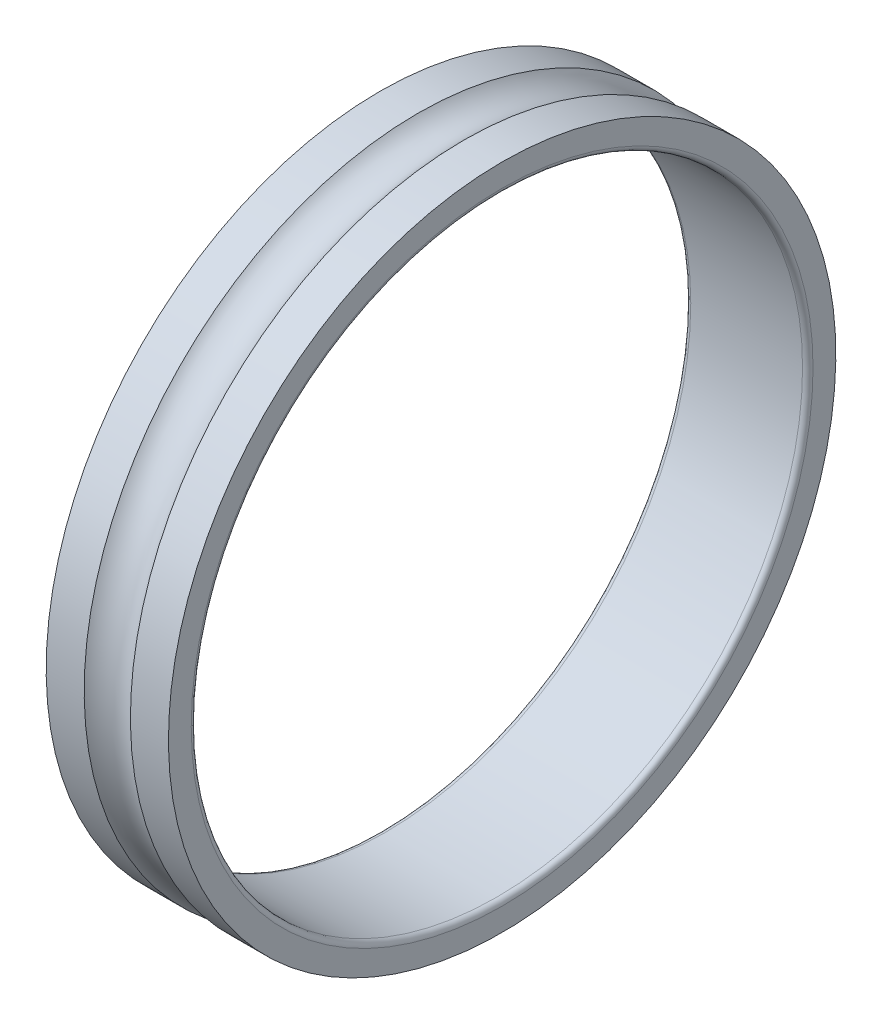
ISO-10303-21;
HEADER;
FILE_DESCRIPTION(('STEP AP214'),'2;1');
FILE_NAME('part.step','',(''),(''),'','','');
FILE_SCHEMA(('AUTOMOTIVE_DESIGN { 1 0 10303 214 1 1 1 1 }'));
ENDSEC;
DATA;
#1=APPLICATION_CONTEXT('core data for automotive mechanical design processes');
#2=APPLICATION_PROTOCOL_DEFINITION('international standard','automotive_design',2000,#1);
#3=PRODUCT_CONTEXT('',#1,'mechanical');
#4=PRODUCT('Part','Part','',(#3));
#5=PRODUCT_RELATED_PRODUCT_CATEGORY('part','',(#4));
#6=PRODUCT_DEFINITION_FORMATION('','',#4);
#7=PRODUCT_DEFINITION_CONTEXT('part definition',#1,'design');
#8=PRODUCT_DEFINITION('design','',#6,#7);
#9=PRODUCT_DEFINITION_SHAPE('','',#8);
#10=(LENGTH_UNIT() NAMED_UNIT(*) SI_UNIT(.MILLI.,.METRE.));
#11=(NAMED_UNIT(*) PLANE_ANGLE_UNIT() SI_UNIT($,.RADIAN.));
#12=(NAMED_UNIT(*) SI_UNIT($,.STERADIAN.) SOLID_ANGLE_UNIT());
#13=UNCERTAINTY_MEASURE_WITH_UNIT(LENGTH_MEASURE(1.E-05),#10,'distance_accuracy_value','');
#14=(GEOMETRIC_REPRESENTATION_CONTEXT(3) GLOBAL_UNCERTAINTY_ASSIGNED_CONTEXT((#13)) GLOBAL_UNIT_ASSIGNED_CONTEXT((#10,
#11,#12)) REPRESENTATION_CONTEXT('',''));
#15=CARTESIAN_POINT('',(0.,0.,0.));
#16=DIRECTION('',(0.,0.,1.));
#17=DIRECTION('',(1.,0.,0.));
#18=AXIS2_PLACEMENT_3D('',#15,#16,#17);
#19=CARTESIAN_POINT('',(5.91171651785338,0.,0.));
#20=DIRECTION('',(-1.,0.,0.));
#21=DIRECTION('',(0.,1.,0.));
#22=AXIS2_PLACEMENT_3D('',#19,#20,#21);
#23=CYLINDRICAL_SURFACE('',#22,19.105);
#24=CARTESIAN_POINT('',(4.82343303570677,0.,0.));
#25=DIRECTION('',(1.,0.,0.));
#26=DIRECTION('',(0.,1.,0.));
#27=AXIS2_PLACEMENT_3D('',#24,#25,#26);
#28=CIRCLE('',#27,19.105);
#29=CARTESIAN_POINT('',(4.82343303570677,19.105,0.));
#30=VERTEX_POINT('',#29);
#31=EDGE_CURVE('E11',#30,#30,#28,.T.);
#32=ORIENTED_EDGE('',*,*,#31,.T.);
#33=EDGE_LOOP('',(#32));
#34=FACE_BOUND('',#33,.T.);
#35=CARTESIAN_POINT('',(7.,0.,0.));
#36=DIRECTION('',(1.,0.,0.));
#37=DIRECTION('',(0.,1.,0.));
#38=AXIS2_PLACEMENT_3D('',#35,#36,#37);
#39=CIRCLE('',#38,19.105);
#40=CARTESIAN_POINT('',(7.,19.105,0.));
#41=VERTEX_POINT('',#40);
#42=EDGE_CURVE('E20',#41,#41,#39,.T.);
#43=ORIENTED_EDGE('',*,*,#42,.F.);
#44=EDGE_LOOP('',(#43));
#45=FACE_BOUND('',#44,.T.);
#46=ADVANCED_FACE('F16',(#34,#45),#23,.T.);
#47=CARTESIAN_POINT('',(3.5,0.,0.));
#48=DIRECTION('',(1.,0.,0.));
#49=DIRECTION('',(0.,0.,-1.));
#50=AXIS2_PLACEMENT_3D('',#47,#48,#49);
#51=TOROIDAL_SURFACE('',#50,20.25,1.75);
#52=CARTESIAN_POINT('',(2.17656696429324,0.,0.));
#53=DIRECTION('',(1.,0.,0.));
#54=DIRECTION('',(0.,1.,0.));
#55=AXIS2_PLACEMENT_3D('',#52,#53,#54);
#56=CIRCLE('',#55,19.105);
#57=CARTESIAN_POINT('',(2.17656696429324,19.105,0.));
#58=VERTEX_POINT('',#57);
#59=EDGE_CURVE('E26',#58,#58,#56,.T.);
#60=ORIENTED_EDGE('',*,*,#59,.T.);
#61=EDGE_LOOP('',(#60));
#62=FACE_BOUND('',#61,.T.);
#63=ORIENTED_EDGE('',*,*,#31,.F.);
#64=EDGE_LOOP('',(#63));
#65=FACE_BOUND('',#64,.T.);
#66=ADVANCED_FACE('F72',(#62,#65),#51,.F.);
#67=CARTESIAN_POINT('',(1.08828348214662,0.,0.));
#68=DIRECTION('',(-1.,0.,0.));
#69=DIRECTION('',(0.,1.,0.));
#70=AXIS2_PLACEMENT_3D('',#67,#68,#69);
#71=CYLINDRICAL_SURFACE('',#70,19.105);
#72=CARTESIAN_POINT('',(0.,0.,0.));
#73=DIRECTION('',(1.,0.,0.));
#74=DIRECTION('',(0.,1.,0.));
#75=AXIS2_PLACEMENT_3D('',#72,#73,#74);
#76=CIRCLE('',#75,19.105);
#77=CARTESIAN_POINT('',(0.,19.105,0.));
#78=VERTEX_POINT('',#77);
#79=EDGE_CURVE('E49',#78,#78,#76,.T.);
#80=ORIENTED_EDGE('',*,*,#79,.T.);
#81=EDGE_LOOP('',(#80));
#82=FACE_BOUND('',#81,.T.);
#83=ORIENTED_EDGE('',*,*,#59,.F.);
#84=EDGE_LOOP('',(#83));
#85=FACE_BOUND('',#84,.T.);
#86=ADVANCED_FACE('F50',(#82,#85),#71,.T.);
#87=CARTESIAN_POINT('',(0.,18.4525,0.));
#88=DIRECTION('',(-1.,0.,0.));
#89=DIRECTION('',(0.,-1.,0.));
#90=AXIS2_PLACEMENT_3D('',#87,#88,#89);
#91=PLANE('',#90);
#92=CARTESIAN_POINT('',(0.,0.,0.));
#93=DIRECTION('',(1.,0.,0.));
#94=DIRECTION('',(0.,1.,0.));
#95=AXIS2_PLACEMENT_3D('',#92,#93,#94);
#96=CIRCLE('',#95,17.8);
#97=CARTESIAN_POINT('',(0.,17.8,0.));
#98=VERTEX_POINT('',#97);
#99=EDGE_CURVE('E53',#98,#98,#96,.T.);
#100=ORIENTED_EDGE('',*,*,#99,.T.);
#101=EDGE_LOOP('',(#100));
#102=FACE_BOUND('',#101,.T.);
#103=ORIENTED_EDGE('',*,*,#79,.F.);
#104=EDGE_LOOP('',(#103));
#105=FACE_BOUND('',#104,.T.);
#106=ADVANCED_FACE('F18',(#102,#105),#91,.T.);
#107=CARTESIAN_POINT('',(0.3,0.,0.));
#108=DIRECTION('',(1.,0.,0.));
#109=DIRECTION('',(0.,0.,-1.));
#110=AXIS2_PLACEMENT_3D('',#107,#108,#109);
#111=TOROIDAL_SURFACE('',#110,17.8,0.3);
#112=CARTESIAN_POINT('',(0.3,0.,0.));
#113=DIRECTION('',(1.,0.,0.));
#114=DIRECTION('',(0.,1.,0.));
#115=AXIS2_PLACEMENT_3D('',#112,#113,#114);
#116=CIRCLE('',#115,17.5);
#117=CARTESIAN_POINT('',(0.3,17.5,0.));
#118=VERTEX_POINT('',#117);
#119=EDGE_CURVE('E56',#118,#118,#116,.T.);
#120=ORIENTED_EDGE('',*,*,#119,.T.);
#121=EDGE_LOOP('',(#120));
#122=FACE_BOUND('',#121,.T.);
#123=ORIENTED_EDGE('',*,*,#99,.F.);
#124=EDGE_LOOP('',(#123));
#125=FACE_BOUND('',#124,.T.);
#126=ADVANCED_FACE('F89',(#122,#125),#111,.T.);
#127=CARTESIAN_POINT('',(3.5,0.,0.));
#128=DIRECTION('',(-1.,0.,0.));
#129=DIRECTION('',(0.,1.,0.));
#130=AXIS2_PLACEMENT_3D('',#127,#128,#129);
#131=CYLINDRICAL_SURFACE('',#130,17.5);
#132=CARTESIAN_POINT('',(6.7,0.,0.));
#133=DIRECTION('',(1.,0.,0.));
#134=DIRECTION('',(0.,1.,0.));
#135=AXIS2_PLACEMENT_3D('',#132,#133,#134);
#136=CIRCLE('',#135,17.5);
#137=CARTESIAN_POINT('',(6.7,17.5,0.));
#138=VERTEX_POINT('',#137);
#139=EDGE_CURVE('E60',#138,#138,#136,.T.);
#140=ORIENTED_EDGE('',*,*,#139,.T.);
#141=EDGE_LOOP('',(#140));
#142=FACE_BOUND('',#141,.T.);
#143=ORIENTED_EDGE('',*,*,#119,.F.);
#144=EDGE_LOOP('',(#143));
#145=FACE_BOUND('',#144,.T.);
#146=ADVANCED_FACE('F94',(#142,#145),#131,.F.);
#147=CARTESIAN_POINT('',(6.7,0.,0.));
#148=DIRECTION('',(1.,0.,0.));
#149=DIRECTION('',(0.,0.,-1.));
#150=AXIS2_PLACEMENT_3D('',#147,#148,#149);
#151=TOROIDAL_SURFACE('',#150,17.8,0.3);
#152=CARTESIAN_POINT('',(7.,0.,0.));
#153=DIRECTION('',(1.,0.,0.));
#154=DIRECTION('',(0.,1.,0.));
#155=AXIS2_PLACEMENT_3D('',#152,#153,#154);
#156=CIRCLE('',#155,17.8);
#157=CARTESIAN_POINT('',(7.,17.8,0.));
#158=VERTEX_POINT('',#157);
#159=EDGE_CURVE('E61',#158,#158,#156,.T.);
#160=ORIENTED_EDGE('',*,*,#159,.T.);
#161=EDGE_LOOP('',(#160));
#162=FACE_BOUND('',#161,.T.);
#163=ORIENTED_EDGE('',*,*,#139,.F.);
#164=EDGE_LOOP('',(#163));
#165=FACE_BOUND('',#164,.T.);
#166=ADVANCED_FACE('F82',(#162,#165),#151,.T.);
#167=CARTESIAN_POINT('',(7.,18.4525,0.));
#168=DIRECTION('',(1.,0.,0.));
#169=DIRECTION('',(0.,1.,0.));
#170=AXIS2_PLACEMENT_3D('',#167,#168,#169);
#171=PLANE('',#170);
#172=ORIENTED_EDGE('',*,*,#42,.T.);
#173=EDGE_LOOP('',(#172));
#174=FACE_BOUND('',#173,.T.);
#175=ORIENTED_EDGE('',*,*,#159,.F.);
#176=EDGE_LOOP('',(#175));
#177=FACE_BOUND('',#176,.T.);
#178=ADVANCED_FACE('F68',(#174,#177),#171,.T.);
#179=CLOSED_SHELL('',(#46,#66,#86,#106,#126,#146,#166,#178));
#180=MANIFOLD_SOLID_BREP('B1',#179);
#181=ADVANCED_BREP_SHAPE_REPRESENTATION('',(#18,#180),#14);
#182=SHAPE_DEFINITION_REPRESENTATION(#9,#181);
ENDSEC;
END-ISO-10303-21;
